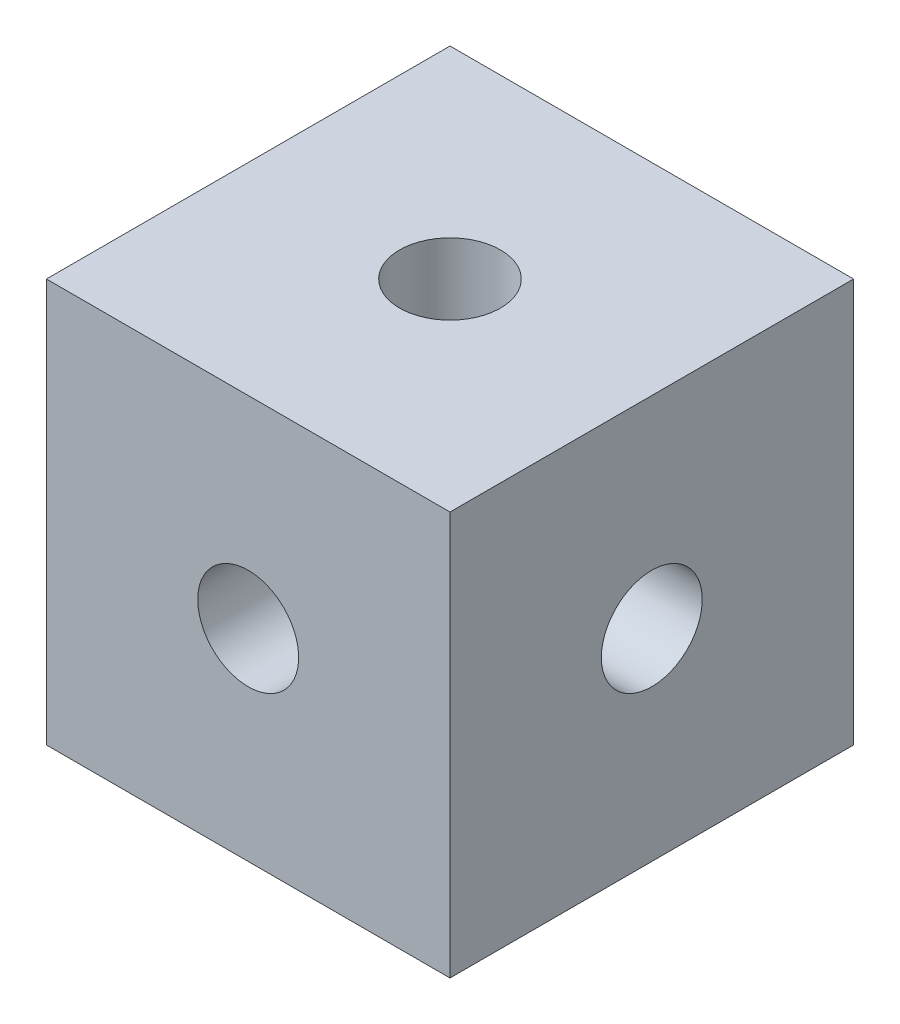
ISO-10303-21;
HEADER;
FILE_DESCRIPTION(('STEP AP214'),'2;1');
FILE_NAME('part.step','',(''),(''),'','','');
FILE_SCHEMA(('AUTOMOTIVE_DESIGN { 1 0 10303 214 1 1 1 1 }'));
ENDSEC;
DATA;
#1=APPLICATION_CONTEXT('core data for automotive mechanical design processes');
#2=APPLICATION_PROTOCOL_DEFINITION('international standard','automotive_design',2000,#1);
#3=PRODUCT_CONTEXT('',#1,'mechanical');
#4=PRODUCT('Part','Part','',(#3));
#5=PRODUCT_RELATED_PRODUCT_CATEGORY('part','',(#4));
#6=PRODUCT_DEFINITION_FORMATION('','',#4);
#7=PRODUCT_DEFINITION_CONTEXT('part definition',#1,'design');
#8=PRODUCT_DEFINITION('design','',#6,#7);
#9=PRODUCT_DEFINITION_SHAPE('','',#8);
#10=(LENGTH_UNIT() NAMED_UNIT(*) SI_UNIT(.MILLI.,.METRE.));
#11=(NAMED_UNIT(*) PLANE_ANGLE_UNIT() SI_UNIT($,.RADIAN.));
#12=(NAMED_UNIT(*) SI_UNIT($,.STERADIAN.) SOLID_ANGLE_UNIT());
#13=UNCERTAINTY_MEASURE_WITH_UNIT(LENGTH_MEASURE(1.E-05),#10,'distance_accuracy_value','');
#14=(GEOMETRIC_REPRESENTATION_CONTEXT(3) GLOBAL_UNCERTAINTY_ASSIGNED_CONTEXT((#13)) GLOBAL_UNIT_ASSIGNED_CONTEXT((#10,
#11,#12)) REPRESENTATION_CONTEXT('',''));
#15=CARTESIAN_POINT('',(0.,0.,0.));
#16=DIRECTION('',(0.,0.,1.));
#17=DIRECTION('',(1.,0.,0.));
#18=AXIS2_PLACEMENT_3D('',#15,#16,#17);
#19=CARTESIAN_POINT('',(0.,0.,0.));
#20=DIRECTION('',(0.,-1.,0.));
#21=DIRECTION('',(0.,0.,-1.));
#22=AXIS2_PLACEMENT_3D('',#19,#20,#21);
#23=CYLINDRICAL_SURFACE('',#22,1.25);
#24=CARTESIAN_POINT('',(0.,0.275000000000001,0.));
#25=DIRECTION('',(0.,-1.,0.));
#26=DIRECTION('',(0.,0.,-1.));
#27=AXIS2_PLACEMENT_3D('',#24,#25,#26);
#28=CIRCLE('',#27,1.25);
#29=CARTESIAN_POINT('',(0.,0.275000000000001,-1.25));
#30=VERTEX_POINT('',#29);
#31=EDGE_CURVE('E170',#30,#30,#28,.T.);
#32=ORIENTED_EDGE('',*,*,#31,.T.);
#33=EDGE_LOOP('',(#32));
#34=FACE_BOUND('',#33,.T.);
#35=CARTESIAN_POINT('',(0.,5.,0.));
#36=DIRECTION('',(0.,-0.707106781186547,-0.707106781186547));
#37=DIRECTION('',(0.,-0.707106781186547,0.707106781186547));
#38=AXIS2_PLACEMENT_3D('',#35,#36,#37);
#39=ELLIPSE('',#38,1.76776695296636,1.24999999999999);
#40=CARTESIAN_POINT('',(-0.88388347648318,4.11611652351682,0.88388347648318));
#41=VERTEX_POINT('',#40);
#42=CARTESIAN_POINT('',(0.88388347648318,4.11611652351682,0.88388347648318));
#43=VERTEX_POINT('',#42);
#44=EDGE_CURVE('E117',#41,#43,#39,.F.);
#45=ORIENTED_EDGE('',*,*,#44,.T.);
#46=CARTESIAN_POINT('',(0.,5.,0.));
#47=DIRECTION('',(-0.707106781186547,-0.707106781186547,0.));
#48=DIRECTION('',(0.707106781186547,-0.707106781186547,0.));
#49=AXIS2_PLACEMENT_3D('',#46,#47,#48);
#50=ELLIPSE('',#49,1.76776695296636,1.24999999999999);
#51=CARTESIAN_POINT('',(0.88388347648318,4.11611652351682,-0.88388347648318));
#52=VERTEX_POINT('',#51);
#53=EDGE_CURVE('E185',#43,#52,#50,.F.);
#54=ORIENTED_EDGE('',*,*,#53,.T.);
#55=CARTESIAN_POINT('',(0.,5.,0.));
#56=DIRECTION('',(0.,-0.707106781186547,0.707106781186547));
#57=DIRECTION('',(0.,-0.707106781186547,-0.707106781186547));
#58=AXIS2_PLACEMENT_3D('',#55,#56,#57);
#59=ELLIPSE('',#58,1.76776695296636,1.24999999999999);
#60=CARTESIAN_POINT('',(-0.88388347648318,4.11611652351682,-0.88388347648318));
#61=VERTEX_POINT('',#60);
#62=EDGE_CURVE('E133',#52,#61,#59,.F.);
#63=ORIENTED_EDGE('',*,*,#62,.T.);
#64=CARTESIAN_POINT('',(0.,5.,0.));
#65=DIRECTION('',(0.707106781186547,-0.707106781186547,0.));
#66=DIRECTION('',(-0.707106781186547,-0.707106781186547,0.));
#67=AXIS2_PLACEMENT_3D('',#64,#65,#66);
#68=ELLIPSE('',#67,1.76776695296636,1.24999999999999);
#69=EDGE_CURVE('E70',#61,#41,#68,.F.);
#70=ORIENTED_EDGE('',*,*,#69,.T.);
#71=EDGE_LOOP('',(#45,#54,#63,#70));
#72=FACE_BOUND('',#71,.T.);
#73=ADVANCED_FACE('F47',(#34,#72),#23,.F.);
#74=CARTESIAN_POINT('',(5.,10.,5.));
#75=DIRECTION('',(-1.,0.,0.));
#76=DIRECTION('',(0.,0.,1.));
#77=AXIS2_PLACEMENT_3D('',#74,#75,#76);
#78=PLANE('',#77);
#79=CARTESIAN_POINT('',(5.,5.,0.));
#80=DIRECTION('',(-1.,0.,0.));
#81=DIRECTION('',(0.,0.,1.));
#82=AXIS2_PLACEMENT_3D('',#79,#80,#81);
#83=CIRCLE('',#82,1.25);
#84=CARTESIAN_POINT('',(5.,5.,1.25));
#85=VERTEX_POINT('',#84);
#86=EDGE_CURVE('E127',#85,#85,#83,.T.);
#87=ORIENTED_EDGE('',*,*,#86,.T.);
#88=EDGE_LOOP('',(#87));
#89=FACE_BOUND('',#88,.T.);
#90=DIRECTION('',(0.,0.,-1.));
#91=VECTOR('',#90,1.);
#92=CARTESIAN_POINT('',(5.,0.,5.));
#93=LINE('',#92,#91);
#94=CARTESIAN_POINT('',(5.,0.,5.));
#95=VERTEX_POINT('',#94);
#96=CARTESIAN_POINT('',(5.,0.,-5.));
#97=VERTEX_POINT('',#96);
#98=EDGE_CURVE('E157',#95,#97,#93,.T.);
#99=ORIENTED_EDGE('',*,*,#98,.T.);
#100=DIRECTION('',(0.,-1.,0.));
#101=VECTOR('',#100,1.);
#102=CARTESIAN_POINT('',(5.,10.,-5.));
#103=LINE('',#102,#101);
#104=CARTESIAN_POINT('',(5.,10.,-5.));
#105=VERTEX_POINT('',#104);
#106=EDGE_CURVE('E137',#105,#97,#103,.T.);
#107=ORIENTED_EDGE('',*,*,#106,.F.);
#108=DIRECTION('',(0.,0.,-1.));
#109=VECTOR('',#108,1.);
#110=CARTESIAN_POINT('',(5.,10.,5.));
#111=LINE('',#110,#109);
#112=CARTESIAN_POINT('',(5.,10.,5.));
#113=VERTEX_POINT('',#112);
#114=EDGE_CURVE('E152',#113,#105,#111,.T.);
#115=ORIENTED_EDGE('',*,*,#114,.F.);
#116=DIRECTION('',(0.,-1.,0.));
#117=VECTOR('',#116,1.);
#118=CARTESIAN_POINT('',(5.,10.,5.));
#119=LINE('',#118,#117);
#120=EDGE_CURVE('E146',#113,#95,#119,.T.);
#121=ORIENTED_EDGE('',*,*,#120,.T.);
#122=EDGE_LOOP('',(#99,#107,#115,#121));
#123=FACE_BOUND('',#122,.T.);
#124=ADVANCED_FACE('F49',(#89,#123),#78,.F.);
#125=CARTESIAN_POINT('',(-5.,10.,-5.));
#126=DIRECTION('',(0.,0.,1.));
#127=DIRECTION('',(1.,0.,0.));
#128=AXIS2_PLACEMENT_3D('',#125,#126,#127);
#129=PLANE('',#128);
#130=CARTESIAN_POINT('',(0.,5.,-5.));
#131=DIRECTION('',(0.,0.,-1.));
#132=DIRECTION('',(-1.,0.,0.));
#133=AXIS2_PLACEMENT_3D('',#130,#131,#132);
#134=CIRCLE('',#133,1.525);
#135=CARTESIAN_POINT('',(-1.525,5.,-5.));
#136=VERTEX_POINT('',#135);
#137=EDGE_CURVE('E182',#136,#136,#134,.T.);
#138=ORIENTED_EDGE('',*,*,#137,.F.);
#139=EDGE_LOOP('',(#138));
#140=FACE_BOUND('',#139,.T.);
#141=DIRECTION('',(-1.,0.,0.));
#142=VECTOR('',#141,1.);
#143=CARTESIAN_POINT('',(-5.,0.,-5.));
#144=LINE('',#143,#142);
#145=CARTESIAN_POINT('',(-5.,0.,-5.));
#146=VERTEX_POINT('',#145);
#147=EDGE_CURVE('E155',#97,#146,#144,.T.);
#148=ORIENTED_EDGE('',*,*,#147,.T.);
#149=DIRECTION('',(0.,-1.,0.));
#150=VECTOR('',#149,1.);
#151=CARTESIAN_POINT('',(-5.,10.,-5.));
#152=LINE('',#151,#150);
#153=CARTESIAN_POINT('',(-5.,10.,-5.));
#154=VERTEX_POINT('',#153);
#155=EDGE_CURVE('E140',#154,#146,#152,.T.);
#156=ORIENTED_EDGE('',*,*,#155,.F.);
#157=DIRECTION('',(-1.,0.,0.));
#158=VECTOR('',#157,1.);
#159=CARTESIAN_POINT('',(-5.,10.,-5.));
#160=LINE('',#159,#158);
#161=EDGE_CURVE('E164',#105,#154,#160,.T.);
#162=ORIENTED_EDGE('',*,*,#161,.F.);
#163=ORIENTED_EDGE('',*,*,#106,.T.);
#164=EDGE_LOOP('',(#148,#156,#162,#163));
#165=FACE_BOUND('',#164,.T.);
#166=ADVANCED_FACE('F208',(#140,#165),#129,.F.);
#167=CARTESIAN_POINT('',(-5.,10.,5.));
#168=DIRECTION('',(1.,0.,0.));
#169=DIRECTION('',(0.,0.,-1.));
#170=AXIS2_PLACEMENT_3D('',#167,#168,#169);
#171=PLANE('',#170);
#172=CARTESIAN_POINT('',(-5.,5.,0.));
#173=DIRECTION('',(-1.,0.,0.));
#174=DIRECTION('',(0.,0.,1.));
#175=AXIS2_PLACEMENT_3D('',#172,#173,#174);
#176=CIRCLE('',#175,1.525);
#177=CARTESIAN_POINT('',(-5.,5.,1.525));
#178=VERTEX_POINT('',#177);
#179=EDGE_CURVE('E198',#178,#178,#176,.T.);
#180=ORIENTED_EDGE('',*,*,#179,.F.);
#181=EDGE_LOOP('',(#180));
#182=FACE_BOUND('',#181,.T.);
#183=DIRECTION('',(0.,0.,1.));
#184=VECTOR('',#183,1.);
#185=CARTESIAN_POINT('',(-5.,0.,5.));
#186=LINE('',#185,#184);
#187=CARTESIAN_POINT('',(-5.,0.,5.));
#188=VERTEX_POINT('',#187);
#189=EDGE_CURVE('E153',#146,#188,#186,.T.);
#190=ORIENTED_EDGE('',*,*,#189,.T.);
#191=DIRECTION('',(0.,-1.,0.));
#192=VECTOR('',#191,1.);
#193=CARTESIAN_POINT('',(-5.,10.,5.));
#194=LINE('',#193,#192);
#195=CARTESIAN_POINT('',(-5.,10.,5.));
#196=VERTEX_POINT('',#195);
#197=EDGE_CURVE('E143',#196,#188,#194,.T.);
#198=ORIENTED_EDGE('',*,*,#197,.F.);
#199=DIRECTION('',(0.,0.,1.));
#200=VECTOR('',#199,1.);
#201=CARTESIAN_POINT('',(-5.,10.,5.));
#202=LINE('',#201,#200);
#203=EDGE_CURVE('E162',#154,#196,#202,.T.);
#204=ORIENTED_EDGE('',*,*,#203,.F.);
#205=ORIENTED_EDGE('',*,*,#155,.T.);
#206=EDGE_LOOP('',(#190,#198,#204,#205));
#207=FACE_BOUND('',#206,.T.);
#208=ADVANCED_FACE('F204',(#182,#207),#171,.F.);
#209=CARTESIAN_POINT('',(-5.,10.,5.));
#210=DIRECTION('',(0.,0.,-1.));
#211=DIRECTION('',(-1.,0.,0.));
#212=AXIS2_PLACEMENT_3D('',#209,#210,#211);
#213=PLANE('',#212);
#214=CARTESIAN_POINT('',(0.,5.,5.));
#215=DIRECTION('',(0.,0.,-1.));
#216=DIRECTION('',(-1.,0.,0.));
#217=AXIS2_PLACEMENT_3D('',#214,#215,#216);
#218=CIRCLE('',#217,1.25);
#219=CARTESIAN_POINT('',(-1.25,5.,5.));
#220=VERTEX_POINT('',#219);
#221=EDGE_CURVE('E176',#220,#220,#218,.T.);
#222=ORIENTED_EDGE('',*,*,#221,.T.);
#223=EDGE_LOOP('',(#222));
#224=FACE_BOUND('',#223,.T.);
#225=DIRECTION('',(1.,0.,0.));
#226=VECTOR('',#225,1.);
#227=CARTESIAN_POINT('',(-5.,0.,5.));
#228=LINE('',#227,#226);
#229=EDGE_CURVE('E150',#188,#95,#228,.T.);
#230=ORIENTED_EDGE('',*,*,#229,.T.);
#231=ORIENTED_EDGE('',*,*,#120,.F.);
#232=DIRECTION('',(1.,0.,0.));
#233=VECTOR('',#232,1.);
#234=CARTESIAN_POINT('',(-5.,10.,5.));
#235=LINE('',#234,#233);
#236=EDGE_CURVE('E149',#196,#113,#235,.T.);
#237=ORIENTED_EDGE('',*,*,#236,.F.);
#238=ORIENTED_EDGE('',*,*,#197,.T.);
#239=EDGE_LOOP('',(#230,#231,#237,#238));
#240=FACE_BOUND('',#239,.T.);
#241=ADVANCED_FACE('F207',(#224,#240),#213,.F.);
#242=CARTESIAN_POINT('',(0.,10.,0.));
#243=DIRECTION('',(0.,-1.,0.));
#244=DIRECTION('',(0.,0.,-1.));
#245=AXIS2_PLACEMENT_3D('',#242,#243,#244);
#246=PLANE('',#245);
#247=CARTESIAN_POINT('',(0.,10.,0.));
#248=DIRECTION('',(0.,-1.,0.));
#249=DIRECTION('',(0.,0.,-1.));
#250=AXIS2_PLACEMENT_3D('',#247,#248,#249);
#251=CIRCLE('',#250,1.25);
#252=CARTESIAN_POINT('',(0.,10.,-1.25));
#253=VERTEX_POINT('',#252);
#254=EDGE_CURVE('E160',#253,#253,#251,.T.);
#255=ORIENTED_EDGE('',*,*,#254,.T.);
#256=EDGE_LOOP('',(#255));
#257=FACE_BOUND('',#256,.T.);
#258=ORIENTED_EDGE('',*,*,#114,.T.);
#259=ORIENTED_EDGE('',*,*,#161,.T.);
#260=ORIENTED_EDGE('',*,*,#203,.T.);
#261=ORIENTED_EDGE('',*,*,#236,.T.);
#262=EDGE_LOOP('',(#258,#259,#260,#261));
#263=FACE_BOUND('',#262,.T.);
#264=ADVANCED_FACE('F225',(#257,#263),#246,.F.);
#265=CARTESIAN_POINT('',(0.,0.,0.));
#266=DIRECTION('',(0.,-1.,0.));
#267=DIRECTION('',(0.,0.,-1.));
#268=AXIS2_PLACEMENT_3D('',#265,#266,#267);
#269=PLANE('',#268);
#270=CARTESIAN_POINT('',(0.,0.,0.));
#271=DIRECTION('',(0.,-1.,0.));
#272=DIRECTION('',(0.,0.,-1.));
#273=AXIS2_PLACEMENT_3D('',#270,#271,#272);
#274=CIRCLE('',#273,1.525);
#275=CARTESIAN_POINT('',(0.,0.,-1.525));
#276=VERTEX_POINT('',#275);
#277=EDGE_CURVE('E173',#276,#276,#274,.T.);
#278=ORIENTED_EDGE('',*,*,#277,.F.);
#279=EDGE_LOOP('',(#278));
#280=FACE_BOUND('',#279,.T.);
#281=ORIENTED_EDGE('',*,*,#98,.F.);
#282=ORIENTED_EDGE('',*,*,#229,.F.);
#283=ORIENTED_EDGE('',*,*,#189,.F.);
#284=ORIENTED_EDGE('',*,*,#147,.F.);
#285=EDGE_LOOP('',(#281,#282,#283,#284));
#286=FACE_BOUND('',#285,.T.);
#287=ADVANCED_FACE('F220',(#280,#286),#269,.T.);
#288=CARTESIAN_POINT('',(0.,5.,0.));
#289=DIRECTION('',(0.,-0.707106781186547,0.707106781186547));
#290=DIRECTION('',(0.,-0.707106781186547,-0.707106781186547));
#291=AXIS2_PLACEMENT_3D('',#288,#289,#290);
#292=ELLIPSE('',#291,1.76776695296636,1.24999999999999);
#293=CARTESIAN_POINT('',(0.883883476483181,5.88388347648318,0.883883476483181));
#294=VERTEX_POINT('',#293);
#295=CARTESIAN_POINT('',(-0.883883476483181,5.88388347648318,0.883883476483181));
#296=VERTEX_POINT('',#295);
#297=EDGE_CURVE('E125',#294,#296,#292,.T.);
#298=ORIENTED_EDGE('',*,*,#297,.T.);
#299=CARTESIAN_POINT('',(0.,5.,0.));
#300=DIRECTION('',(-0.707106781186547,-0.707106781186547,0.));
#301=DIRECTION('',(0.707106781186547,-0.707106781186547,0.));
#302=AXIS2_PLACEMENT_3D('',#299,#300,#301);
#303=ELLIPSE('',#302,1.76776695296636,1.24999999999999);
#304=CARTESIAN_POINT('',(-0.88388347648318,5.88388347648318,-0.88388347648318));
#305=VERTEX_POINT('',#304);
#306=EDGE_CURVE('E111',#296,#305,#303,.T.);
#307=ORIENTED_EDGE('',*,*,#306,.T.);
#308=CARTESIAN_POINT('',(0.,5.,0.));
#309=DIRECTION('',(0.,-0.707106781186547,-0.707106781186547));
#310=DIRECTION('',(0.,-0.707106781186547,0.707106781186547));
#311=AXIS2_PLACEMENT_3D('',#308,#309,#310);
#312=ELLIPSE('',#311,1.76776695296636,1.24999999999999);
#313=CARTESIAN_POINT('',(0.883883476483181,5.88388347648318,-0.883883476483181));
#314=VERTEX_POINT('',#313);
#315=EDGE_CURVE('E123',#305,#314,#312,.T.);
#316=ORIENTED_EDGE('',*,*,#315,.T.);
#317=CARTESIAN_POINT('',(0.,5.,0.));
#318=DIRECTION('',(0.707106781186547,-0.707106781186547,0.));
#319=DIRECTION('',(-0.707106781186547,-0.707106781186547,0.));
#320=AXIS2_PLACEMENT_3D('',#317,#318,#319);
#321=ELLIPSE('',#320,1.76776695296636,1.24999999999999);
#322=EDGE_CURVE('E189',#314,#294,#321,.T.);
#323=ORIENTED_EDGE('',*,*,#322,.T.);
#324=EDGE_LOOP('',(#298,#307,#316,#323));
#325=FACE_BOUND('',#324,.T.);
#326=ORIENTED_EDGE('',*,*,#254,.F.);
#327=EDGE_LOOP('',(#326));
#328=FACE_BOUND('',#327,.T.);
#329=ADVANCED_FACE('F121',(#325,#328),#23,.F.);
#330=CARTESIAN_POINT('',(0.,0.,0.));
#331=DIRECTION('',(0.,-1.,0.));
#332=DIRECTION('',(0.,0.,-1.));
#333=AXIS2_PLACEMENT_3D('',#330,#331,#332);
#334=CONICAL_SURFACE('',#333,1.525,0.785398163397448);
#335=ORIENTED_EDGE('',*,*,#31,.F.);
#336=EDGE_LOOP('',(#335));
#337=FACE_BOUND('',#336,.T.);
#338=ORIENTED_EDGE('',*,*,#277,.T.);
#339=EDGE_LOOP('',(#338));
#340=FACE_BOUND('',#339,.T.);
#341=ADVANCED_FACE('F245',(#337,#340),#334,.F.);
#342=CARTESIAN_POINT('',(0.,5.,-5.));
#343=DIRECTION('',(0.,0.,-1.));
#344=DIRECTION('',(-1.,0.,0.));
#345=AXIS2_PLACEMENT_3D('',#342,#343,#344);
#346=CYLINDRICAL_SURFACE('',#345,1.24999999999999);
#347=CARTESIAN_POINT('',(0.,5.,-4.72499999999999));
#348=DIRECTION('',(0.,0.,-1.));
#349=DIRECTION('',(-1.,0.,0.));
#350=AXIS2_PLACEMENT_3D('',#347,#348,#349);
#351=CIRCLE('',#350,1.24999999999999);
#352=CARTESIAN_POINT('',(-1.24999999999999,5.,-4.72499999999999));
#353=VERTEX_POINT('',#352);
#354=EDGE_CURVE('E179',#353,#353,#351,.T.);
#355=ORIENTED_EDGE('',*,*,#354,.T.);
#356=EDGE_LOOP('',(#355));
#357=FACE_BOUND('',#356,.T.);
#358=ORIENTED_EDGE('',*,*,#62,.F.);
#359=CARTESIAN_POINT('',(0.,5.,0.));
#360=DIRECTION('',(-0.707106781186547,0.,-0.707106781186547));
#361=DIRECTION('',(0.707106781186547,0.,-0.707106781186547));
#362=AXIS2_PLACEMENT_3D('',#359,#360,#361);
#363=ELLIPSE('',#362,1.76776695296636,1.24999999999999);
#364=EDGE_CURVE('E11',#52,#314,#363,.F.);
#365=ORIENTED_EDGE('',*,*,#364,.T.);
#366=ORIENTED_EDGE('',*,*,#315,.F.);
#367=CARTESIAN_POINT('',(0.,5.,0.));
#368=DIRECTION('',(0.707106781186547,0.,-0.707106781186547));
#369=DIRECTION('',(-0.707106781186547,0.,-0.707106781186547));
#370=AXIS2_PLACEMENT_3D('',#367,#368,#369);
#371=ELLIPSE('',#370,1.76776695296636,1.24999999999999);
#372=EDGE_CURVE('E55',#305,#61,#371,.F.);
#373=ORIENTED_EDGE('',*,*,#372,.T.);
#374=EDGE_LOOP('',(#358,#365,#366,#373));
#375=FACE_BOUND('',#374,.T.);
#376=ADVANCED_FACE('F129',(#357,#375),#346,.F.);
#377=CARTESIAN_POINT('',(0.,5.,-5.));
#378=DIRECTION('',(0.,0.,-1.));
#379=DIRECTION('',(-1.,0.,0.));
#380=AXIS2_PLACEMENT_3D('',#377,#378,#379);
#381=CONICAL_SURFACE('',#380,1.525,0.785398163397448);
#382=ORIENTED_EDGE('',*,*,#354,.F.);
#383=EDGE_LOOP('',(#382));
#384=FACE_BOUND('',#383,.T.);
#385=ORIENTED_EDGE('',*,*,#137,.T.);
#386=EDGE_LOOP('',(#385));
#387=FACE_BOUND('',#386,.T.);
#388=ADVANCED_FACE('F268',(#384,#387),#381,.F.);
#389=ORIENTED_EDGE('',*,*,#221,.F.);
#390=EDGE_LOOP('',(#389));
#391=FACE_BOUND('',#390,.T.);
#392=ORIENTED_EDGE('',*,*,#44,.F.);
#393=CARTESIAN_POINT('',(0.,5.,0.));
#394=DIRECTION('',(-0.707106781186547,0.,-0.707106781186547));
#395=DIRECTION('',(0.707106781186547,0.,-0.707106781186547));
#396=AXIS2_PLACEMENT_3D('',#393,#394,#395);
#397=ELLIPSE('',#396,1.76776695296636,1.24999999999999);
#398=EDGE_CURVE('E126',#41,#296,#397,.T.);
#399=ORIENTED_EDGE('',*,*,#398,.T.);
#400=ORIENTED_EDGE('',*,*,#297,.F.);
#401=CARTESIAN_POINT('',(0.,5.,0.));
#402=DIRECTION('',(0.707106781186547,0.,-0.707106781186547));
#403=DIRECTION('',(-0.707106781186547,0.,-0.707106781186547));
#404=AXIS2_PLACEMENT_3D('',#401,#402,#403);
#405=ELLIPSE('',#404,1.76776695296636,1.24999999999999);
#406=EDGE_CURVE('E62',#294,#43,#405,.T.);
#407=ORIENTED_EDGE('',*,*,#406,.T.);
#408=EDGE_LOOP('',(#392,#399,#400,#407));
#409=FACE_BOUND('',#408,.T.);
#410=ADVANCED_FACE('F265',(#391,#409),#346,.F.);
#411=CARTESIAN_POINT('',(-5.,5.,0.));
#412=DIRECTION('',(-1.,0.,0.));
#413=DIRECTION('',(0.,0.,1.));
#414=AXIS2_PLACEMENT_3D('',#411,#412,#413);
#415=CYLINDRICAL_SURFACE('',#414,1.24999999999999);
#416=CARTESIAN_POINT('',(-4.72499999999999,5.,0.));
#417=DIRECTION('',(-1.,0.,0.));
#418=DIRECTION('',(0.,0.,1.));
#419=AXIS2_PLACEMENT_3D('',#416,#417,#418);
#420=CIRCLE('',#419,1.24999999999999);
#421=CARTESIAN_POINT('',(-4.72499999999999,5.,1.24999999999999));
#422=VERTEX_POINT('',#421);
#423=EDGE_CURVE('E195',#422,#422,#420,.T.);
#424=ORIENTED_EDGE('',*,*,#423,.T.);
#425=EDGE_LOOP('',(#424));
#426=FACE_BOUND('',#425,.T.);
#427=ORIENTED_EDGE('',*,*,#372,.F.);
#428=ORIENTED_EDGE('',*,*,#306,.F.);
#429=ORIENTED_EDGE('',*,*,#398,.F.);
#430=ORIENTED_EDGE('',*,*,#69,.F.);
#431=EDGE_LOOP('',(#427,#428,#429,#430));
#432=FACE_BOUND('',#431,.T.);
#433=ADVANCED_FACE('F110',(#426,#432),#415,.F.);
#434=CARTESIAN_POINT('',(-5.,5.,0.));
#435=DIRECTION('',(-1.,0.,0.));
#436=DIRECTION('',(0.,0.,1.));
#437=AXIS2_PLACEMENT_3D('',#434,#435,#436);
#438=CONICAL_SURFACE('',#437,1.525,0.785398163397448);
#439=ORIENTED_EDGE('',*,*,#423,.F.);
#440=EDGE_LOOP('',(#439));
#441=FACE_BOUND('',#440,.T.);
#442=ORIENTED_EDGE('',*,*,#179,.T.);
#443=EDGE_LOOP('',(#442));
#444=FACE_BOUND('',#443,.T.);
#445=ADVANCED_FACE('F202',(#441,#444),#438,.F.);
#446=ORIENTED_EDGE('',*,*,#86,.F.);
#447=EDGE_LOOP('',(#446));
#448=FACE_BOUND('',#447,.T.);
#449=ORIENTED_EDGE('',*,*,#406,.F.);
#450=ORIENTED_EDGE('',*,*,#322,.F.);
#451=ORIENTED_EDGE('',*,*,#364,.F.);
#452=ORIENTED_EDGE('',*,*,#53,.F.);
#453=EDGE_LOOP('',(#449,#450,#451,#452));
#454=FACE_BOUND('',#453,.T.);
#455=ADVANCED_FACE('F271',(#448,#454),#415,.F.);
#456=CLOSED_SHELL('',(#73,#124,#166,#208,#241,#264,#287,#329,#341,#376,#388,#410,#433,#445,#455));
#457=MANIFOLD_SOLID_BREP('B2',#456);
#458=ADVANCED_BREP_SHAPE_REPRESENTATION('',(#18,#457),#14);
#459=SHAPE_DEFINITION_REPRESENTATION(#9,#458);
ENDSEC;
END-ISO-10303-21;
